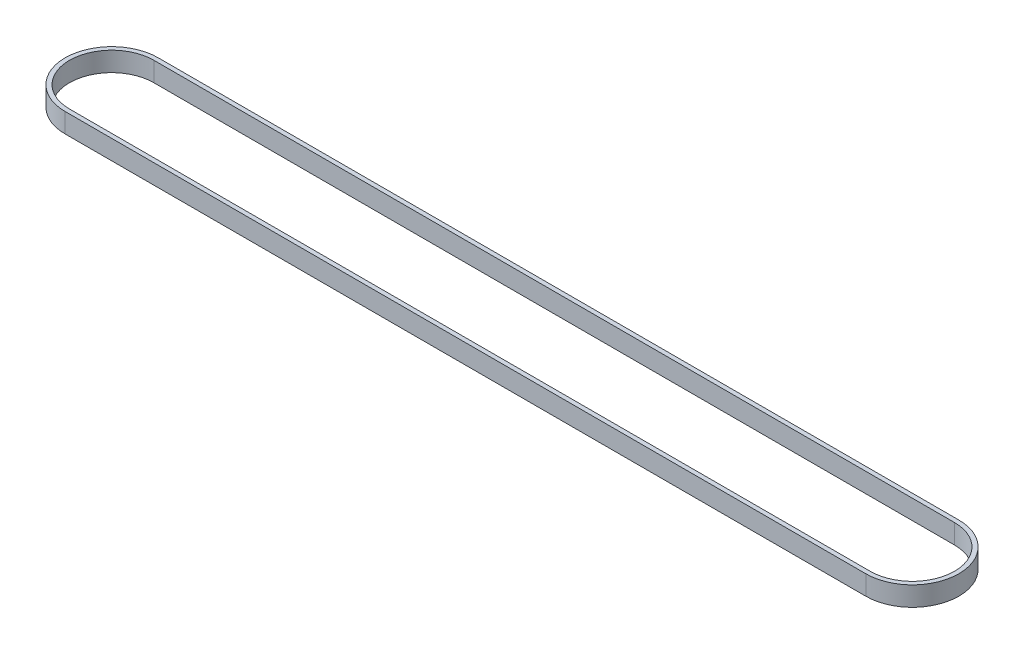
ISO-10303-21;
HEADER;
FILE_DESCRIPTION(('STEP AP214'),'2;1');
FILE_NAME('part.step','',(''),(''),'','','');
FILE_SCHEMA(('AUTOMOTIVE_DESIGN { 1 0 10303 214 1 1 1 1 }'));
ENDSEC;
DATA;
#1=APPLICATION_CONTEXT('core data for automotive mechanical design processes');
#2=APPLICATION_PROTOCOL_DEFINITION('international standard','automotive_design',2000,#1);
#3=PRODUCT_CONTEXT('',#1,'mechanical');
#4=PRODUCT('Part','Part','',(#3));
#5=PRODUCT_RELATED_PRODUCT_CATEGORY('part','',(#4));
#6=PRODUCT_DEFINITION_FORMATION('','',#4);
#7=PRODUCT_DEFINITION_CONTEXT('part definition',#1,'design');
#8=PRODUCT_DEFINITION('design','',#6,#7);
#9=PRODUCT_DEFINITION_SHAPE('','',#8);
#10=(LENGTH_UNIT() NAMED_UNIT(*) SI_UNIT(.MILLI.,.METRE.));
#11=(NAMED_UNIT(*) PLANE_ANGLE_UNIT() SI_UNIT($,.RADIAN.));
#12=(NAMED_UNIT(*) SI_UNIT($,.STERADIAN.) SOLID_ANGLE_UNIT());
#13=UNCERTAINTY_MEASURE_WITH_UNIT(LENGTH_MEASURE(1.E-05),#10,'distance_accuracy_value','');
#14=(GEOMETRIC_REPRESENTATION_CONTEXT(3) GLOBAL_UNCERTAINTY_ASSIGNED_CONTEXT((#13)) GLOBAL_UNIT_ASSIGNED_CONTEXT((#10,
#11,#12)) REPRESENTATION_CONTEXT('',''));
#15=CARTESIAN_POINT('',(0.,0.,0.));
#16=DIRECTION('',(0.,0.,1.));
#17=DIRECTION('',(1.,0.,0.));
#18=AXIS2_PLACEMENT_3D('',#15,#16,#17);
#19=CARTESIAN_POINT('',(-185.,4.5,0.));
#20=DIRECTION('',(0.,1.,0.));
#21=DIRECTION('',(0.,0.,1.));
#22=AXIS2_PLACEMENT_3D('',#19,#20,#21);
#23=PLANE('',#22);
#24=CARTESIAN_POINT('',(-185.,4.5,0.));
#25=DIRECTION('',(0.,1.,0.));
#26=DIRECTION('',(0.,0.,1.));
#27=AXIS2_PLACEMENT_3D('',#24,#25,#26);
#28=CIRCLE('',#27,21.5);
#29=CARTESIAN_POINT('',(-185.,4.5,-21.5));
#30=VERTEX_POINT('',#29);
#31=CARTESIAN_POINT('',(-185.,4.5,21.5));
#32=VERTEX_POINT('',#31);
#33=EDGE_CURVE('E136',#30,#32,#28,.T.);
#34=ORIENTED_EDGE('',*,*,#33,.T.);
#35=DIRECTION('',(1.,0.,0.));
#36=VECTOR('',#35,1.);
#37=CARTESIAN_POINT('',(-185.,4.5,21.5));
#38=LINE('',#37,#36);
#39=CARTESIAN_POINT('',(185.,4.5,21.5));
#40=VERTEX_POINT('',#39);
#41=EDGE_CURVE('E139',#32,#40,#38,.T.);
#42=ORIENTED_EDGE('',*,*,#41,.T.);
#43=CARTESIAN_POINT('',(185.,4.5,0.));
#44=DIRECTION('',(0.,1.,0.));
#45=DIRECTION('',(0.,0.,1.));
#46=AXIS2_PLACEMENT_3D('',#43,#44,#45);
#47=CIRCLE('',#46,21.5);
#48=CARTESIAN_POINT('',(185.,4.5,-21.5));
#49=VERTEX_POINT('',#48);
#50=EDGE_CURVE('E142',#40,#49,#47,.T.);
#51=ORIENTED_EDGE('',*,*,#50,.T.);
#52=DIRECTION('',(-1.,0.,0.));
#53=VECTOR('',#52,1.);
#54=CARTESIAN_POINT('',(-185.,4.5,-21.5));
#55=LINE('',#54,#53);
#56=EDGE_CURVE('E144',#49,#30,#55,.T.);
#57=ORIENTED_EDGE('',*,*,#56,.T.);
#58=EDGE_LOOP('',(#34,#42,#51,#57));
#59=FACE_BOUND('',#58,.T.);
#60=DIRECTION('',(1.,0.,0.));
#61=VECTOR('',#60,1.);
#62=CARTESIAN_POINT('',(-185.,4.5,19.5));
#63=LINE('',#62,#61);
#64=CARTESIAN_POINT('',(-185.,4.5,19.5));
#65=VERTEX_POINT('',#64);
#66=CARTESIAN_POINT('',(185.,4.5,19.5));
#67=VERTEX_POINT('',#66);
#68=EDGE_CURVE('E108',#65,#67,#63,.T.);
#69=ORIENTED_EDGE('',*,*,#68,.F.);
#70=CARTESIAN_POINT('',(-185.,4.5,0.));
#71=DIRECTION('',(0.,1.,0.));
#72=DIRECTION('',(0.,0.,1.));
#73=AXIS2_PLACEMENT_3D('',#70,#71,#72);
#74=CIRCLE('',#73,19.5);
#75=CARTESIAN_POINT('',(-185.,4.5,-19.5));
#76=VERTEX_POINT('',#75);
#77=EDGE_CURVE('E100',#76,#65,#74,.T.);
#78=ORIENTED_EDGE('',*,*,#77,.F.);
#79=DIRECTION('',(-1.,0.,0.));
#80=VECTOR('',#79,1.);
#81=CARTESIAN_POINT('',(-185.,4.5,-19.5));
#82=LINE('',#81,#80);
#83=CARTESIAN_POINT('',(185.,4.5,-19.5));
#84=VERTEX_POINT('',#83);
#85=EDGE_CURVE('E122',#84,#76,#82,.T.);
#86=ORIENTED_EDGE('',*,*,#85,.F.);
#87=CARTESIAN_POINT('',(185.,4.5,0.));
#88=DIRECTION('',(0.,1.,0.));
#89=DIRECTION('',(0.,0.,1.));
#90=AXIS2_PLACEMENT_3D('',#87,#88,#89);
#91=CIRCLE('',#90,19.5);
#92=EDGE_CURVE('E120',#67,#84,#91,.T.);
#93=ORIENTED_EDGE('',*,*,#92,.F.);
#94=EDGE_LOOP('',(#69,#78,#86,#93));
#95=FACE_BOUND('',#94,.T.);
#96=ADVANCED_FACE('F35',(#59,#95),#23,.T.);
#97=CARTESIAN_POINT('',(-185.,-4.5,0.));
#98=DIRECTION('',(0.,1.,0.));
#99=DIRECTION('',(0.,0.,1.));
#100=AXIS2_PLACEMENT_3D('',#97,#98,#99);
#101=PLANE('',#100);
#102=CARTESIAN_POINT('',(-185.,-4.5,0.));
#103=DIRECTION('',(0.,1.,0.));
#104=DIRECTION('',(0.,0.,1.));
#105=AXIS2_PLACEMENT_3D('',#102,#103,#104);
#106=CIRCLE('',#105,21.5);
#107=CARTESIAN_POINT('',(-185.,-4.5,-21.5));
#108=VERTEX_POINT('',#107);
#109=CARTESIAN_POINT('',(-185.,-4.5,21.5));
#110=VERTEX_POINT('',#109);
#111=EDGE_CURVE('E116',#108,#110,#106,.T.);
#112=ORIENTED_EDGE('',*,*,#111,.F.);
#113=DIRECTION('',(-1.,0.,0.));
#114=VECTOR('',#113,1.);
#115=CARTESIAN_POINT('',(-185.,-4.5,-21.5));
#116=LINE('',#115,#114);
#117=CARTESIAN_POINT('',(185.,-4.5,-21.5));
#118=VERTEX_POINT('',#117);
#119=EDGE_CURVE('E140',#118,#108,#116,.T.);
#120=ORIENTED_EDGE('',*,*,#119,.F.);
#121=CARTESIAN_POINT('',(185.,-4.5,0.));
#122=DIRECTION('',(0.,1.,0.));
#123=DIRECTION('',(0.,0.,1.));
#124=AXIS2_PLACEMENT_3D('',#121,#122,#123);
#125=CIRCLE('',#124,21.5);
#126=CARTESIAN_POINT('',(185.,-4.5,21.5));
#127=VERTEX_POINT('',#126);
#128=EDGE_CURVE('E151',#127,#118,#125,.T.);
#129=ORIENTED_EDGE('',*,*,#128,.F.);
#130=DIRECTION('',(1.,0.,0.));
#131=VECTOR('',#130,1.);
#132=CARTESIAN_POINT('',(-185.,-4.5,21.5));
#133=LINE('',#132,#131);
#134=EDGE_CURVE('E149',#110,#127,#133,.T.);
#135=ORIENTED_EDGE('',*,*,#134,.F.);
#136=EDGE_LOOP('',(#112,#120,#129,#135));
#137=FACE_BOUND('',#136,.T.);
#138=CARTESIAN_POINT('',(-185.,-4.5,0.));
#139=DIRECTION('',(0.,1.,0.));
#140=DIRECTION('',(0.,0.,1.));
#141=AXIS2_PLACEMENT_3D('',#138,#139,#140);
#142=CIRCLE('',#141,19.5);
#143=CARTESIAN_POINT('',(-185.,-4.5,-19.5));
#144=VERTEX_POINT('',#143);
#145=CARTESIAN_POINT('',(-185.,-4.5,19.5));
#146=VERTEX_POINT('',#145);
#147=EDGE_CURVE('E58',#144,#146,#142,.T.);
#148=ORIENTED_EDGE('',*,*,#147,.T.);
#149=DIRECTION('',(1.,0.,0.));
#150=VECTOR('',#149,1.);
#151=CARTESIAN_POINT('',(-185.,-4.5,19.5));
#152=LINE('',#151,#150);
#153=CARTESIAN_POINT('',(185.,-4.5,19.5));
#154=VERTEX_POINT('',#153);
#155=EDGE_CURVE('E115',#146,#154,#152,.T.);
#156=ORIENTED_EDGE('',*,*,#155,.T.);
#157=CARTESIAN_POINT('',(185.,-4.5,0.));
#158=DIRECTION('',(0.,1.,0.));
#159=DIRECTION('',(0.,0.,1.));
#160=AXIS2_PLACEMENT_3D('',#157,#158,#159);
#161=CIRCLE('',#160,19.5);
#162=CARTESIAN_POINT('',(185.,-4.5,-19.5));
#163=VERTEX_POINT('',#162);
#164=EDGE_CURVE('E128',#154,#163,#161,.T.);
#165=ORIENTED_EDGE('',*,*,#164,.T.);
#166=DIRECTION('',(-1.,0.,0.));
#167=VECTOR('',#166,1.);
#168=CARTESIAN_POINT('',(-185.,-4.5,-19.5));
#169=LINE('',#168,#167);
#170=EDGE_CURVE('E109',#163,#144,#169,.T.);
#171=ORIENTED_EDGE('',*,*,#170,.T.);
#172=EDGE_LOOP('',(#148,#156,#165,#171));
#173=FACE_BOUND('',#172,.T.);
#174=ADVANCED_FACE('F169',(#137,#173),#101,.F.);
#175=CARTESIAN_POINT('',(-185.,4.5,0.));
#176=DIRECTION('',(0.,-1.,0.));
#177=DIRECTION('',(0.,0.,-1.));
#178=AXIS2_PLACEMENT_3D('',#175,#176,#177);
#179=CYLINDRICAL_SURFACE('',#178,21.5);
#180=ORIENTED_EDGE('',*,*,#111,.T.);
#181=DIRECTION('',(0.,-1.,0.));
#182=VECTOR('',#181,1.);
#183=CARTESIAN_POINT('',(-185.,4.5,21.5));
#184=LINE('',#183,#182);
#185=EDGE_CURVE('E11',#32,#110,#184,.T.);
#186=ORIENTED_EDGE('',*,*,#185,.F.);
#187=ORIENTED_EDGE('',*,*,#33,.F.);
#188=DIRECTION('',(0.,-1.,0.));
#189=VECTOR('',#188,1.);
#190=CARTESIAN_POINT('',(-185.,4.5,-21.5));
#191=LINE('',#190,#189);
#192=EDGE_CURVE('E146',#30,#108,#191,.T.);
#193=ORIENTED_EDGE('',*,*,#192,.T.);
#194=EDGE_LOOP('',(#180,#186,#187,#193));
#195=FACE_BOUND('',#194,.T.);
#196=ADVANCED_FACE('F37',(#195),#179,.T.);
#197=CARTESIAN_POINT('',(-185.,4.5,21.5));
#198=DIRECTION('',(0.,0.,-1.));
#199=DIRECTION('',(-1.,0.,0.));
#200=AXIS2_PLACEMENT_3D('',#197,#198,#199);
#201=PLANE('',#200);
#202=ORIENTED_EDGE('',*,*,#134,.T.);
#203=DIRECTION('',(0.,-1.,0.));
#204=VECTOR('',#203,1.);
#205=CARTESIAN_POINT('',(185.,4.5,21.5));
#206=LINE('',#205,#204);
#207=EDGE_CURVE('E43',#40,#127,#206,.T.);
#208=ORIENTED_EDGE('',*,*,#207,.F.);
#209=ORIENTED_EDGE('',*,*,#41,.F.);
#210=ORIENTED_EDGE('',*,*,#185,.T.);
#211=EDGE_LOOP('',(#202,#208,#209,#210));
#212=FACE_BOUND('',#211,.T.);
#213=ADVANCED_FACE('F179',(#212),#201,.F.);
#214=CARTESIAN_POINT('',(185.,4.5,0.));
#215=DIRECTION('',(0.,-1.,0.));
#216=DIRECTION('',(0.,0.,-1.));
#217=AXIS2_PLACEMENT_3D('',#214,#215,#216);
#218=CYLINDRICAL_SURFACE('',#217,21.5);
#219=ORIENTED_EDGE('',*,*,#128,.T.);
#220=DIRECTION('',(0.,-1.,0.));
#221=VECTOR('',#220,1.);
#222=CARTESIAN_POINT('',(185.,4.5,-21.5));
#223=LINE('',#222,#221);
#224=EDGE_CURVE('E156',#49,#118,#223,.T.);
#225=ORIENTED_EDGE('',*,*,#224,.F.);
#226=ORIENTED_EDGE('',*,*,#50,.F.);
#227=ORIENTED_EDGE('',*,*,#207,.T.);
#228=EDGE_LOOP('',(#219,#225,#226,#227));
#229=FACE_BOUND('',#228,.T.);
#230=ADVANCED_FACE('F163',(#229),#218,.T.);
#231=CARTESIAN_POINT('',(-185.,4.5,-21.5));
#232=DIRECTION('',(0.,0.,1.));
#233=DIRECTION('',(1.,0.,0.));
#234=AXIS2_PLACEMENT_3D('',#231,#232,#233);
#235=PLANE('',#234);
#236=ORIENTED_EDGE('',*,*,#119,.T.);
#237=ORIENTED_EDGE('',*,*,#192,.F.);
#238=ORIENTED_EDGE('',*,*,#56,.F.);
#239=ORIENTED_EDGE('',*,*,#224,.T.);
#240=EDGE_LOOP('',(#236,#237,#238,#239));
#241=FACE_BOUND('',#240,.T.);
#242=ADVANCED_FACE('F173',(#241),#235,.F.);
#243=CARTESIAN_POINT('',(-185.,4.5,0.));
#244=DIRECTION('',(0.,-1.,0.));
#245=DIRECTION('',(0.,0.,-1.));
#246=AXIS2_PLACEMENT_3D('',#243,#244,#245);
#247=CYLINDRICAL_SURFACE('',#246,19.5);
#248=ORIENTED_EDGE('',*,*,#147,.F.);
#249=DIRECTION('',(0.,-1.,0.));
#250=VECTOR('',#249,1.);
#251=CARTESIAN_POINT('',(-185.,4.5,-19.5));
#252=LINE('',#251,#250);
#253=EDGE_CURVE('E104',#76,#144,#252,.T.);
#254=ORIENTED_EDGE('',*,*,#253,.F.);
#255=ORIENTED_EDGE('',*,*,#77,.T.);
#256=DIRECTION('',(0.,-1.,0.));
#257=VECTOR('',#256,1.);
#258=CARTESIAN_POINT('',(-185.,4.5,19.5));
#259=LINE('',#258,#257);
#260=EDGE_CURVE('E103',#65,#146,#259,.T.);
#261=ORIENTED_EDGE('',*,*,#260,.T.);
#262=EDGE_LOOP('',(#248,#254,#255,#261));
#263=FACE_BOUND('',#262,.T.);
#264=ADVANCED_FACE('F102',(#263),#247,.F.);
#265=CARTESIAN_POINT('',(-185.,4.5,19.5));
#266=DIRECTION('',(0.,0.,-1.));
#267=DIRECTION('',(-1.,0.,0.));
#268=AXIS2_PLACEMENT_3D('',#265,#266,#267);
#269=PLANE('',#268);
#270=ORIENTED_EDGE('',*,*,#155,.F.);
#271=ORIENTED_EDGE('',*,*,#260,.F.);
#272=ORIENTED_EDGE('',*,*,#68,.T.);
#273=DIRECTION('',(0.,-1.,0.));
#274=VECTOR('',#273,1.);
#275=CARTESIAN_POINT('',(185.,4.5,19.5));
#276=LINE('',#275,#274);
#277=EDGE_CURVE('E117',#67,#154,#276,.T.);
#278=ORIENTED_EDGE('',*,*,#277,.T.);
#279=EDGE_LOOP('',(#270,#271,#272,#278));
#280=FACE_BOUND('',#279,.T.);
#281=ADVANCED_FACE('F112',(#280),#269,.T.);
#282=CARTESIAN_POINT('',(185.,4.5,0.));
#283=DIRECTION('',(0.,-1.,0.));
#284=DIRECTION('',(0.,0.,-1.));
#285=AXIS2_PLACEMENT_3D('',#282,#283,#284);
#286=CYLINDRICAL_SURFACE('',#285,19.5);
#287=ORIENTED_EDGE('',*,*,#164,.F.);
#288=ORIENTED_EDGE('',*,*,#277,.F.);
#289=ORIENTED_EDGE('',*,*,#92,.T.);
#290=DIRECTION('',(0.,-1.,0.));
#291=VECTOR('',#290,1.);
#292=CARTESIAN_POINT('',(185.,4.5,-19.5));
#293=LINE('',#292,#291);
#294=EDGE_CURVE('E50',#84,#163,#293,.T.);
#295=ORIENTED_EDGE('',*,*,#294,.T.);
#296=EDGE_LOOP('',(#287,#288,#289,#295));
#297=FACE_BOUND('',#296,.T.);
#298=ADVANCED_FACE('F202',(#297),#286,.F.);
#299=CARTESIAN_POINT('',(-185.,4.5,-19.5));
#300=DIRECTION('',(0.,0.,1.));
#301=DIRECTION('',(1.,0.,0.));
#302=AXIS2_PLACEMENT_3D('',#299,#300,#301);
#303=PLANE('',#302);
#304=ORIENTED_EDGE('',*,*,#170,.F.);
#305=ORIENTED_EDGE('',*,*,#294,.F.);
#306=ORIENTED_EDGE('',*,*,#85,.T.);
#307=ORIENTED_EDGE('',*,*,#253,.T.);
#308=EDGE_LOOP('',(#304,#305,#306,#307));
#309=FACE_BOUND('',#308,.T.);
#310=ADVANCED_FACE('F206',(#309),#303,.T.);
#311=CLOSED_SHELL('',(#96,#174,#196,#213,#230,#242,#264,#281,#298,#310));
#312=MANIFOLD_SOLID_BREP('B2',#311);
#313=ADVANCED_BREP_SHAPE_REPRESENTATION('',(#18,#312),#14);
#314=SHAPE_DEFINITION_REPRESENTATION(#9,#313);
ENDSEC;
END-ISO-10303-21;
